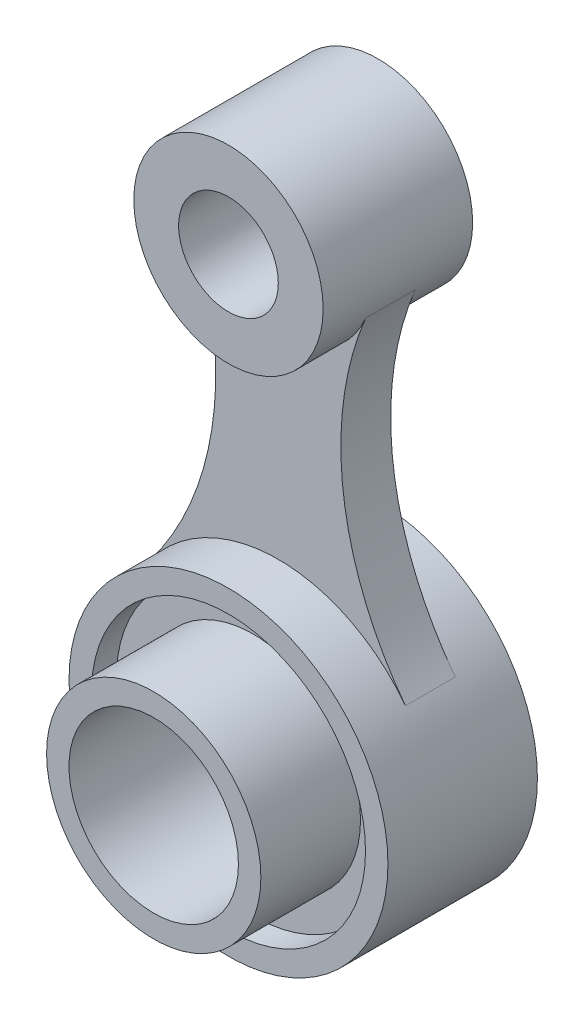
ISO-10303-21;
HEADER;
FILE_DESCRIPTION(('STEP AP214'),'2;1');
FILE_NAME('part.step','',(''),(''),'','','');
FILE_SCHEMA(('AUTOMOTIVE_DESIGN { 1 0 10303 214 1 1 1 1 }'));
ENDSEC;
DATA;
#1=APPLICATION_CONTEXT('core data for automotive mechanical design processes');
#2=APPLICATION_PROTOCOL_DEFINITION('international standard','automotive_design',2000,#1);
#3=PRODUCT_CONTEXT('',#1,'mechanical');
#4=PRODUCT('Part','Part','',(#3));
#5=PRODUCT_RELATED_PRODUCT_CATEGORY('part','',(#4));
#6=PRODUCT_DEFINITION_FORMATION('','',#4);
#7=PRODUCT_DEFINITION_CONTEXT('part definition',#1,'design');
#8=PRODUCT_DEFINITION('design','',#6,#7);
#9=PRODUCT_DEFINITION_SHAPE('','',#8);
#10=(LENGTH_UNIT() NAMED_UNIT(*) SI_UNIT(.MILLI.,.METRE.));
#11=(NAMED_UNIT(*) PLANE_ANGLE_UNIT() SI_UNIT($,.RADIAN.));
#12=(NAMED_UNIT(*) SI_UNIT($,.STERADIAN.) SOLID_ANGLE_UNIT());
#13=UNCERTAINTY_MEASURE_WITH_UNIT(LENGTH_MEASURE(1.E-05),#10,'distance_accuracy_value','');
#14=(GEOMETRIC_REPRESENTATION_CONTEXT(3) GLOBAL_UNCERTAINTY_ASSIGNED_CONTEXT((#13)) GLOBAL_UNIT_ASSIGNED_CONTEXT((#10,
#11,#12)) REPRESENTATION_CONTEXT('',''));
#15=CARTESIAN_POINT('',(0.,0.,0.));
#16=DIRECTION('',(0.,0.,1.));
#17=DIRECTION('',(1.,0.,0.));
#18=AXIS2_PLACEMENT_3D('',#15,#16,#17);
#19=CARTESIAN_POINT('',(0.,0.,0.));
#20=DIRECTION('',(0.,0.,1.));
#21=DIRECTION('',(1.,0.,0.));
#22=AXIS2_PLACEMENT_3D('',#19,#20,#21);
#23=CYLINDRICAL_SURFACE('',#22,32.);
#24=CARTESIAN_POINT('',(0.,0.,-45.));
#25=DIRECTION('',(0.,0.,1.));
#26=DIRECTION('',(1.,0.,0.));
#27=AXIS2_PLACEMENT_3D('',#24,#25,#26);
#28=CIRCLE('',#27,32.);
#29=CARTESIAN_POINT('',(32.,0.,-45.));
#30=VERTEX_POINT('',#29);
#31=EDGE_CURVE('E158',#30,#30,#28,.T.);
#32=ORIENTED_EDGE('',*,*,#31,.T.);
#33=EDGE_LOOP('',(#32));
#34=FACE_BOUND('',#33,.T.);
#35=CARTESIAN_POINT('',(0.,0.,-15.));
#36=DIRECTION('',(0.,0.,1.));
#37=DIRECTION('',(1.,0.,0.));
#38=AXIS2_PLACEMENT_3D('',#35,#36,#37);
#39=CIRCLE('',#38,32.);
#40=CARTESIAN_POINT('',(32.,0.,-15.));
#41=VERTEX_POINT('',#40);
#42=EDGE_CURVE('E154',#41,#41,#39,.T.);
#43=ORIENTED_EDGE('',*,*,#42,.F.);
#44=EDGE_LOOP('',(#43));
#45=FACE_BOUND('',#44,.T.);
#46=CARTESIAN_POINT('',(0.,0.,-35.));
#47=DIRECTION('',(0.,0.,-1.));
#48=DIRECTION('',(1.,0.,0.));
#49=AXIS2_PLACEMENT_3D('',#46,#47,#48);
#50=CIRCLE('',#49,32.);
#51=CARTESIAN_POINT('',(-25.5176900768606,19.3092592592592,-35.));
#52=VERTEX_POINT('',#51);
#53=CARTESIAN_POINT('',(25.5176900768606,19.3092592592593,-35.));
#54=VERTEX_POINT('',#53);
#55=EDGE_CURVE('E102',#52,#54,#50,.T.);
#56=ORIENTED_EDGE('',*,*,#55,.T.);
#57=DIRECTION('',(0.,0.,1.));
#58=VECTOR('',#57,1.);
#59=CARTESIAN_POINT('',(25.5176900768606,19.3092592592593,-35.));
#60=LINE('',#59,#58);
#61=CARTESIAN_POINT('',(25.5176900768606,19.3092592592593,-25.));
#62=VERTEX_POINT('',#61);
#63=EDGE_CURVE('E69',#54,#62,#60,.T.);
#64=ORIENTED_EDGE('',*,*,#63,.T.);
#65=CARTESIAN_POINT('',(0.,0.,-25.));
#66=DIRECTION('',(0.,0.,-1.));
#67=DIRECTION('',(1.,0.,0.));
#68=AXIS2_PLACEMENT_3D('',#65,#66,#67);
#69=CIRCLE('',#68,32.);
#70=CARTESIAN_POINT('',(-25.5176900768606,19.3092592592593,-25.));
#71=VERTEX_POINT('',#70);
#72=EDGE_CURVE('E106',#71,#62,#69,.T.);
#73=ORIENTED_EDGE('',*,*,#72,.F.);
#74=DIRECTION('',(0.,0.,1.));
#75=VECTOR('',#74,1.);
#76=CARTESIAN_POINT('',(-25.5176900768606,19.3092592592592,-35.));
#77=LINE('',#76,#75);
#78=EDGE_CURVE('E134',#52,#71,#77,.T.);
#79=ORIENTED_EDGE('',*,*,#78,.F.);
#80=EDGE_LOOP('',(#56,#64,#73,#79));
#81=FACE_BOUND('',#80,.T.);
#82=ADVANCED_FACE('F45',(#34,#45,#81),#23,.T.);
#83=CARTESIAN_POINT('',(0.,21.5,0.));
#84=DIRECTION('',(0.,0.,-1.));
#85=DIRECTION('',(-1.,0.,0.));
#86=AXIS2_PLACEMENT_3D('',#83,#84,#85);
#87=PLANE('',#86);
#88=CARTESIAN_POINT('',(0.,0.,0.));
#89=DIRECTION('',(0.,0.,1.));
#90=DIRECTION('',(1.,0.,0.));
#91=AXIS2_PLACEMENT_3D('',#88,#89,#90);
#92=CIRCLE('',#91,17.);
#93=CARTESIAN_POINT('',(17.,0.,0.));
#94=VERTEX_POINT('',#93);
#95=EDGE_CURVE('E11',#94,#94,#92,.T.);
#96=ORIENTED_EDGE('',*,*,#95,.F.);
#97=EDGE_LOOP('',(#96));
#98=FACE_BOUND('',#97,.T.);
#99=CARTESIAN_POINT('',(0.,0.,0.));
#100=DIRECTION('',(0.,0.,1.));
#101=DIRECTION('',(1.,0.,0.));
#102=AXIS2_PLACEMENT_3D('',#99,#100,#101);
#103=CIRCLE('',#102,21.5);
#104=CARTESIAN_POINT('',(21.5,0.,0.));
#105=VERTEX_POINT('',#104);
#106=EDGE_CURVE('E147',#105,#105,#103,.T.);
#107=ORIENTED_EDGE('',*,*,#106,.T.);
#108=EDGE_LOOP('',(#107));
#109=FACE_BOUND('',#108,.T.);
#110=ADVANCED_FACE('F47',(#98,#109),#87,.F.);
#111=CARTESIAN_POINT('',(0.,0.,0.));
#112=DIRECTION('',(0.,0.,1.));
#113=DIRECTION('',(1.,0.,0.));
#114=AXIS2_PLACEMENT_3D('',#111,#112,#113);
#115=CYLINDRICAL_SURFACE('',#114,17.);
#116=CARTESIAN_POINT('',(0.,0.,-45.));
#117=DIRECTION('',(0.,0.,1.));
#118=DIRECTION('',(1.,0.,0.));
#119=AXIS2_PLACEMENT_3D('',#116,#117,#118);
#120=CIRCLE('',#119,17.);
#121=CARTESIAN_POINT('',(17.,0.,-45.));
#122=VERTEX_POINT('',#121);
#123=EDGE_CURVE('E54',#122,#122,#120,.T.);
#124=ORIENTED_EDGE('',*,*,#123,.F.);
#125=EDGE_LOOP('',(#124));
#126=FACE_BOUND('',#125,.T.);
#127=ORIENTED_EDGE('',*,*,#95,.T.);
#128=EDGE_LOOP('',(#127));
#129=FACE_BOUND('',#128,.T.);
#130=ADVANCED_FACE('F167',(#126,#129),#115,.F.);
#131=CARTESIAN_POINT('',(0.,17.,-45.));
#132=DIRECTION('',(0.,0.,1.));
#133=DIRECTION('',(1.,0.,0.));
#134=AXIS2_PLACEMENT_3D('',#131,#132,#133);
#135=PLANE('',#134);
#136=ORIENTED_EDGE('',*,*,#31,.F.);
#137=EDGE_LOOP('',(#136));
#138=FACE_BOUND('',#137,.T.);
#139=ORIENTED_EDGE('',*,*,#123,.T.);
#140=EDGE_LOOP('',(#139));
#141=FACE_BOUND('',#140,.T.);
#142=ADVANCED_FACE('F165',(#138,#141),#135,.F.);
#143=CARTESIAN_POINT('',(0.,32.,-15.));
#144=DIRECTION('',(0.,0.,-1.));
#145=DIRECTION('',(-1.,0.,0.));
#146=AXIS2_PLACEMENT_3D('',#143,#144,#145);
#147=PLANE('',#146);
#148=CARTESIAN_POINT('',(0.,0.,-15.));
#149=DIRECTION('',(0.,0.,1.));
#150=DIRECTION('',(1.,0.,0.));
#151=AXIS2_PLACEMENT_3D('',#148,#149,#150);
#152=CIRCLE('',#151,27.5);
#153=CARTESIAN_POINT('',(27.5,0.,-15.));
#154=VERTEX_POINT('',#153);
#155=EDGE_CURVE('E142',#154,#154,#152,.T.);
#156=ORIENTED_EDGE('',*,*,#155,.F.);
#157=EDGE_LOOP('',(#156));
#158=FACE_BOUND('',#157,.T.);
#159=ORIENTED_EDGE('',*,*,#42,.T.);
#160=EDGE_LOOP('',(#159));
#161=FACE_BOUND('',#160,.T.);
#162=ADVANCED_FACE('F180',(#158,#161),#147,.F.);
#163=CARTESIAN_POINT('',(0.,0.,0.));
#164=DIRECTION('',(0.,0.,1.));
#165=DIRECTION('',(1.,0.,0.));
#166=AXIS2_PLACEMENT_3D('',#163,#164,#165);
#167=CYLINDRICAL_SURFACE('',#166,21.5);
#168=ORIENTED_EDGE('',*,*,#106,.F.);
#169=EDGE_LOOP('',(#168));
#170=FACE_BOUND('',#169,.T.);
#171=CARTESIAN_POINT('',(0.,0.,-20.));
#172=DIRECTION('',(0.,0.,1.));
#173=DIRECTION('',(1.,0.,0.));
#174=AXIS2_PLACEMENT_3D('',#171,#172,#173);
#175=CIRCLE('',#174,21.5);
#176=CARTESIAN_POINT('',(21.5,0.,-20.));
#177=VERTEX_POINT('',#176);
#178=EDGE_CURVE('E133',#177,#177,#175,.T.);
#179=ORIENTED_EDGE('',*,*,#178,.T.);
#180=EDGE_LOOP('',(#179));
#181=FACE_BOUND('',#180,.T.);
#182=ADVANCED_FACE('F176',(#170,#181),#167,.T.);
#183=CARTESIAN_POINT('',(0.,0.,-20.));
#184=DIRECTION('',(0.,0.,1.));
#185=DIRECTION('',(1.,0.,0.));
#186=AXIS2_PLACEMENT_3D('',#183,#184,#185);
#187=CYLINDRICAL_SURFACE('',#186,27.5);
#188=CARTESIAN_POINT('',(0.,0.,-20.));
#189=DIRECTION('',(0.,0.,1.));
#190=DIRECTION('',(1.,0.,0.));
#191=AXIS2_PLACEMENT_3D('',#188,#189,#190);
#192=CIRCLE('',#191,27.5);
#193=CARTESIAN_POINT('',(27.5,0.,-20.));
#194=VERTEX_POINT('',#193);
#195=EDGE_CURVE('E143',#194,#194,#192,.T.);
#196=ORIENTED_EDGE('',*,*,#195,.F.);
#197=EDGE_LOOP('',(#196));
#198=FACE_BOUND('',#197,.T.);
#199=ORIENTED_EDGE('',*,*,#155,.T.);
#200=EDGE_LOOP('',(#199));
#201=FACE_BOUND('',#200,.T.);
#202=ADVANCED_FACE('F179',(#198,#201),#187,.F.);
#203=CARTESIAN_POINT('',(0.,0.,-20.));
#204=DIRECTION('',(0.,0.,1.));
#205=DIRECTION('',(1.,0.,0.));
#206=AXIS2_PLACEMENT_3D('',#203,#204,#205);
#207=PLANE('',#206);
#208=ORIENTED_EDGE('',*,*,#178,.F.);
#209=EDGE_LOOP('',(#208));
#210=FACE_BOUND('',#209,.T.);
#211=ORIENTED_EDGE('',*,*,#195,.T.);
#212=EDGE_LOOP('',(#211));
#213=FACE_BOUND('',#212,.T.);
#214=ADVANCED_FACE('F184',(#210,#213),#207,.T.);
#215=CARTESIAN_POINT('',(76.5530702305819,57.9277777777778,-35.));
#216=DIRECTION('',(0.,0.,1.));
#217=DIRECTION('',(1.,0.,0.));
#218=AXIS2_PLACEMENT_3D('',#215,#216,#217);
#219=CYLINDRICAL_SURFACE('',#218,64.);
#220=DIRECTION('',(0.,0.,1.));
#221=VECTOR('',#220,1.);
#222=CARTESIAN_POINT('',(17.5241967997717,82.6581659973226,-35.));
#223=LINE('',#222,#221);
#224=CARTESIAN_POINT('',(17.5241967997717,82.6581659973226,-35.));
#225=VERTEX_POINT('',#224);
#226=CARTESIAN_POINT('',(17.5241967997717,82.6581659973226,-25.));
#227=VERTEX_POINT('',#226);
#228=EDGE_CURVE('E91',#225,#227,#223,.T.);
#229=ORIENTED_EDGE('',*,*,#228,.T.);
#230=CARTESIAN_POINT('',(76.5530702305819,57.9277777777778,-25.));
#231=DIRECTION('',(0.,0.,-1.));
#232=DIRECTION('',(1.,0.,0.));
#233=AXIS2_PLACEMENT_3D('',#230,#231,#232);
#234=CIRCLE('',#233,64.);
#235=EDGE_CURVE('E97',#62,#227,#234,.T.);
#236=ORIENTED_EDGE('',*,*,#235,.F.);
#237=ORIENTED_EDGE('',*,*,#63,.F.);
#238=CARTESIAN_POINT('',(76.5530702305819,57.9277777777778,-35.));
#239=DIRECTION('',(0.,0.,-1.));
#240=DIRECTION('',(1.,0.,0.));
#241=AXIS2_PLACEMENT_3D('',#238,#239,#240);
#242=CIRCLE('',#241,64.);
#243=EDGE_CURVE('E100',#54,#225,#242,.T.);
#244=ORIENTED_EDGE('',*,*,#243,.T.);
#245=EDGE_LOOP('',(#229,#236,#237,#244));
#246=FACE_BOUND('',#245,.T.);
#247=ADVANCED_FACE('F99',(#246),#219,.F.);
#248=CARTESIAN_POINT('',(-76.5530702305819,57.9277777777778,-35.));
#249=DIRECTION('',(0.,0.,1.));
#250=DIRECTION('',(1.,0.,0.));
#251=AXIS2_PLACEMENT_3D('',#248,#249,#250);
#252=CYLINDRICAL_SURFACE('',#251,64.);
#253=ORIENTED_EDGE('',*,*,#78,.T.);
#254=CARTESIAN_POINT('',(-76.5530702305819,57.9277777777778,-25.));
#255=DIRECTION('',(0.,0.,-1.));
#256=DIRECTION('',(1.,0.,0.));
#257=AXIS2_PLACEMENT_3D('',#254,#255,#256);
#258=CIRCLE('',#257,64.);
#259=CARTESIAN_POINT('',(-17.5241967997717,82.6581659973226,-25.));
#260=VERTEX_POINT('',#259);
#261=EDGE_CURVE('E61',#260,#71,#258,.T.);
#262=ORIENTED_EDGE('',*,*,#261,.F.);
#263=DIRECTION('',(0.,0.,1.));
#264=VECTOR('',#263,1.);
#265=CARTESIAN_POINT('',(-17.5241967997717,82.6581659973226,-35.));
#266=LINE('',#265,#264);
#267=CARTESIAN_POINT('',(-17.5241967997717,82.6581659973226,-35.));
#268=VERTEX_POINT('',#267);
#269=EDGE_CURVE('E94',#268,#260,#266,.T.);
#270=ORIENTED_EDGE('',*,*,#269,.F.);
#271=CARTESIAN_POINT('',(-76.5530702305819,57.9277777777778,-35.));
#272=DIRECTION('',(0.,0.,-1.));
#273=DIRECTION('',(1.,0.,0.));
#274=AXIS2_PLACEMENT_3D('',#271,#272,#273);
#275=CIRCLE('',#274,64.);
#276=EDGE_CURVE('E125',#268,#52,#275,.T.);
#277=ORIENTED_EDGE('',*,*,#276,.T.);
#278=EDGE_LOOP('',(#253,#262,#270,#277));
#279=FACE_BOUND('',#278,.T.);
#280=ADVANCED_FACE('F210',(#279),#252,.F.);
#281=CARTESIAN_POINT('',(38.2765351152909,28.9638888888889,-35.));
#282=DIRECTION('',(0.,0.,1.));
#283=DIRECTION('',(1.,0.,0.));
#284=AXIS2_PLACEMENT_3D('',#281,#282,#283);
#285=PLANE('',#284);
#286=ORIENTED_EDGE('',*,*,#243,.F.);
#287=ORIENTED_EDGE('',*,*,#55,.F.);
#288=ORIENTED_EDGE('',*,*,#276,.F.);
#289=CARTESIAN_POINT('',(0.,90.,-35.));
#290=DIRECTION('',(0.,0.,-1.));
#291=DIRECTION('',(1.,0.,0.));
#292=AXIS2_PLACEMENT_3D('',#289,#290,#291);
#293=CIRCLE('',#292,19.);
#294=EDGE_CURVE('E122',#225,#268,#293,.T.);
#295=ORIENTED_EDGE('',*,*,#294,.F.);
#296=EDGE_LOOP('',(#286,#287,#288,#295));
#297=FACE_BOUND('',#296,.T.);
#298=ADVANCED_FACE('F208',(#297),#285,.F.);
#299=CARTESIAN_POINT('',(38.2765351152909,28.9638888888889,-25.));
#300=DIRECTION('',(0.,0.,1.));
#301=DIRECTION('',(1.,0.,0.));
#302=AXIS2_PLACEMENT_3D('',#299,#300,#301);
#303=PLANE('',#302);
#304=ORIENTED_EDGE('',*,*,#235,.T.);
#305=CARTESIAN_POINT('',(0.,90.,-25.));
#306=DIRECTION('',(0.,0.,-1.));
#307=DIRECTION('',(1.,0.,0.));
#308=AXIS2_PLACEMENT_3D('',#305,#306,#307);
#309=CIRCLE('',#308,19.);
#310=EDGE_CURVE('E88',#227,#260,#309,.T.);
#311=ORIENTED_EDGE('',*,*,#310,.T.);
#312=ORIENTED_EDGE('',*,*,#261,.T.);
#313=ORIENTED_EDGE('',*,*,#72,.T.);
#314=EDGE_LOOP('',(#304,#311,#312,#313));
#315=FACE_BOUND('',#314,.T.);
#316=ADVANCED_FACE('F104',(#315),#303,.T.);
#317=CARTESIAN_POINT('',(0.,90.,-45.));
#318=DIRECTION('',(0.,0.,1.));
#319=DIRECTION('',(1.,0.,0.));
#320=AXIS2_PLACEMENT_3D('',#317,#318,#319);
#321=CYLINDRICAL_SURFACE('',#320,19.);
#322=CARTESIAN_POINT('',(0.,90.,-15.));
#323=DIRECTION('',(0.,0.,1.));
#324=DIRECTION('',(1.,0.,0.));
#325=AXIS2_PLACEMENT_3D('',#322,#323,#324);
#326=CIRCLE('',#325,19.);
#327=CARTESIAN_POINT('',(19.,90.,-15.));
#328=VERTEX_POINT('',#327);
#329=EDGE_CURVE('E315',#328,#328,#326,.T.);
#330=ORIENTED_EDGE('',*,*,#329,.F.);
#331=EDGE_LOOP('',(#330));
#332=FACE_BOUND('',#331,.T.);
#333=CARTESIAN_POINT('',(0.,90.,-45.));
#334=DIRECTION('',(0.,0.,1.));
#335=DIRECTION('',(1.,0.,0.));
#336=AXIS2_PLACEMENT_3D('',#333,#334,#335);
#337=CIRCLE('',#336,19.);
#338=CARTESIAN_POINT('',(19.,90.,-45.));
#339=VERTEX_POINT('',#338);
#340=EDGE_CURVE('E108',#339,#339,#337,.T.);
#341=ORIENTED_EDGE('',*,*,#340,.T.);
#342=EDGE_LOOP('',(#341));
#343=FACE_BOUND('',#342,.T.);
#344=ORIENTED_EDGE('',*,*,#294,.T.);
#345=ORIENTED_EDGE('',*,*,#269,.T.);
#346=ORIENTED_EDGE('',*,*,#310,.F.);
#347=ORIENTED_EDGE('',*,*,#228,.F.);
#348=EDGE_LOOP('',(#344,#345,#346,#347));
#349=FACE_BOUND('',#348,.T.);
#350=ADVANCED_FACE('F90',(#332,#343,#349),#321,.T.);
#351=CARTESIAN_POINT('',(0.,90.,-45.));
#352=DIRECTION('',(0.,0.,1.));
#353=DIRECTION('',(1.,0.,0.));
#354=AXIS2_PLACEMENT_3D('',#351,#352,#353);
#355=PLANE('',#354);
#356=CARTESIAN_POINT('',(0.,90.,-45.));
#357=DIRECTION('',(0.,0.,1.));
#358=DIRECTION('',(1.,0.,0.));
#359=AXIS2_PLACEMENT_3D('',#356,#357,#358);
#360=CIRCLE('',#359,10.);
#361=CARTESIAN_POINT('',(10.,90.,-45.));
#362=VERTEX_POINT('',#361);
#363=EDGE_CURVE('E112',#362,#362,#360,.T.);
#364=ORIENTED_EDGE('',*,*,#363,.T.);
#365=EDGE_LOOP('',(#364));
#366=FACE_BOUND('',#365,.T.);
#367=ORIENTED_EDGE('',*,*,#340,.F.);
#368=EDGE_LOOP('',(#367));
#369=FACE_BOUND('',#368,.T.);
#370=ADVANCED_FACE('F289',(#366,#369),#355,.F.);
#371=CARTESIAN_POINT('',(0.,90.,-45.));
#372=DIRECTION('',(0.,0.,1.));
#373=DIRECTION('',(1.,0.,0.));
#374=AXIS2_PLACEMENT_3D('',#371,#372,#373);
#375=CYLINDRICAL_SURFACE('',#374,10.);
#376=ORIENTED_EDGE('',*,*,#363,.F.);
#377=EDGE_LOOP('',(#376));
#378=FACE_BOUND('',#377,.T.);
#379=CARTESIAN_POINT('',(0.,90.,-15.));
#380=DIRECTION('',(0.,0.,1.));
#381=DIRECTION('',(1.,0.,0.));
#382=AXIS2_PLACEMENT_3D('',#379,#380,#381);
#383=CIRCLE('',#382,10.);
#384=CARTESIAN_POINT('',(10.,90.,-15.));
#385=VERTEX_POINT('',#384);
#386=EDGE_CURVE('E318',#385,#385,#383,.T.);
#387=ORIENTED_EDGE('',*,*,#386,.T.);
#388=EDGE_LOOP('',(#387));
#389=FACE_BOUND('',#388,.T.);
#390=ADVANCED_FACE('F298',(#378,#389),#375,.F.);
#391=CARTESIAN_POINT('',(0.,90.,-15.));
#392=DIRECTION('',(0.,0.,1.));
#393=DIRECTION('',(1.,0.,0.));
#394=AXIS2_PLACEMENT_3D('',#391,#392,#393);
#395=PLANE('',#394);
#396=ORIENTED_EDGE('',*,*,#329,.T.);
#397=EDGE_LOOP('',(#396));
#398=FACE_BOUND('',#397,.T.);
#399=ORIENTED_EDGE('',*,*,#386,.F.);
#400=EDGE_LOOP('',(#399));
#401=FACE_BOUND('',#400,.T.);
#402=ADVANCED_FACE('F265',(#398,#401),#395,.T.);
#403=CLOSED_SHELL('',(#82,#110,#130,#142,#162,#182,#202,#214,#247,#280,#298,#316,#350,#370,#390,#402));
#404=MANIFOLD_SOLID_BREP('B2',#403);
#405=ADVANCED_BREP_SHAPE_REPRESENTATION('',(#18,#404),#14);
#406=SHAPE_DEFINITION_REPRESENTATION(#9,#405);
ENDSEC;
END-ISO-10303-21;
